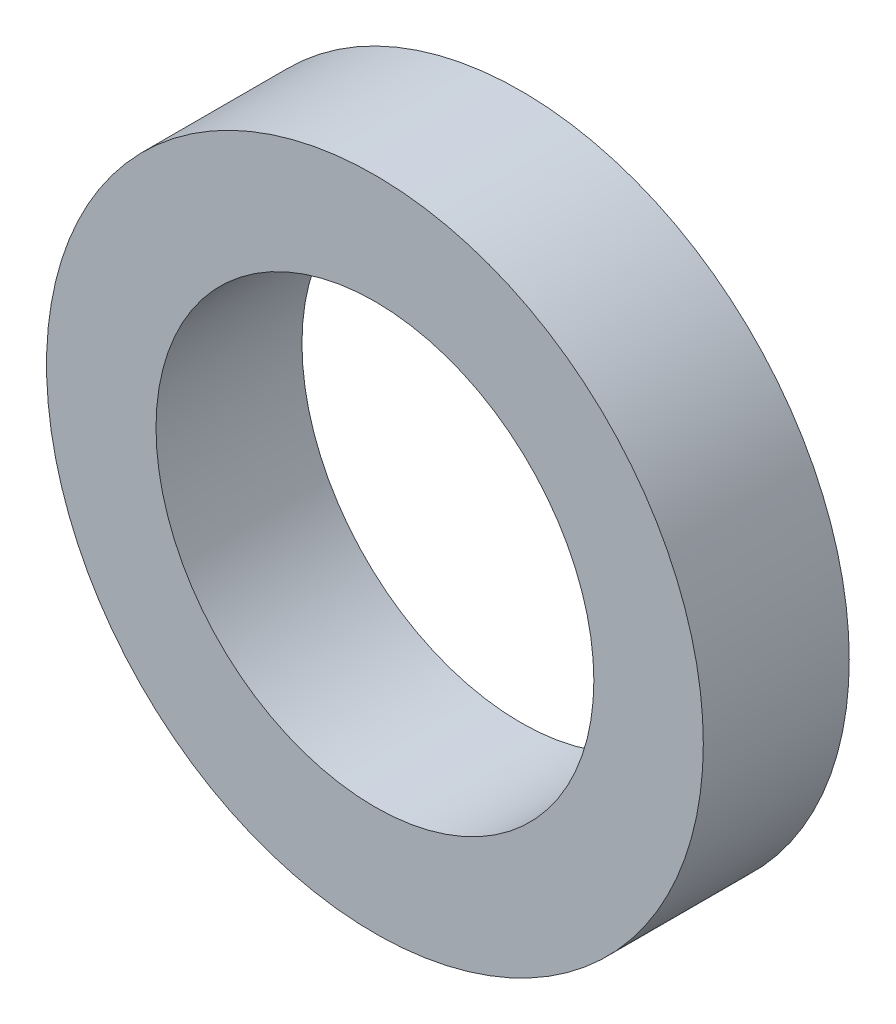
ISO-10303-21;
HEADER;
FILE_DESCRIPTION(('STEP AP214'),'2;1');
FILE_NAME('part.step','',(''),(''),'','','');
FILE_SCHEMA(('AUTOMOTIVE_DESIGN { 1 0 10303 214 1 1 1 1 }'));
ENDSEC;
DATA;
#1=APPLICATION_CONTEXT('core data for automotive mechanical design processes');
#2=APPLICATION_PROTOCOL_DEFINITION('international standard','automotive_design',2000,#1);
#3=PRODUCT_CONTEXT('',#1,'mechanical');
#4=PRODUCT('Part','Part','',(#3));
#5=PRODUCT_RELATED_PRODUCT_CATEGORY('part','',(#4));
#6=PRODUCT_DEFINITION_FORMATION('','',#4);
#7=PRODUCT_DEFINITION_CONTEXT('part definition',#1,'design');
#8=PRODUCT_DEFINITION('design','',#6,#7);
#9=PRODUCT_DEFINITION_SHAPE('','',#8);
#10=(LENGTH_UNIT() NAMED_UNIT(*) SI_UNIT(.MILLI.,.METRE.));
#11=(NAMED_UNIT(*) PLANE_ANGLE_UNIT() SI_UNIT($,.RADIAN.));
#12=(NAMED_UNIT(*) SI_UNIT($,.STERADIAN.) SOLID_ANGLE_UNIT());
#13=UNCERTAINTY_MEASURE_WITH_UNIT(LENGTH_MEASURE(1.E-05),#10,'distance_accuracy_value','');
#14=(GEOMETRIC_REPRESENTATION_CONTEXT(3) GLOBAL_UNCERTAINTY_ASSIGNED_CONTEXT((#13)) GLOBAL_UNIT_ASSIGNED_CONTEXT((#10,
#11,#12)) REPRESENTATION_CONTEXT('',''));
#15=CARTESIAN_POINT('',(0.,0.,0.));
#16=DIRECTION('',(0.,0.,1.));
#17=DIRECTION('',(1.,0.,0.));
#18=AXIS2_PLACEMENT_3D('',#15,#16,#17);
#19=CARTESIAN_POINT('',(0.,0.,2.));
#20=DIRECTION('',(0.,0.,1.));
#21=DIRECTION('',(1.,0.,0.));
#22=AXIS2_PLACEMENT_3D('',#19,#20,#21);
#23=PLANE('',#22);
#24=CARTESIAN_POINT('',(0.,0.,2.));
#25=DIRECTION('',(0.,0.,1.));
#26=DIRECTION('',(1.,0.,0.));
#27=AXIS2_PLACEMENT_3D('',#24,#25,#26);
#28=CIRCLE('',#27,4.5);
#29=CARTESIAN_POINT('',(4.5,0.,2.));
#30=VERTEX_POINT('',#29);
#31=EDGE_CURVE('E10',#30,#30,#28,.T.);
#32=ORIENTED_EDGE('',*,*,#31,.T.);
#33=EDGE_LOOP('',(#32));
#34=FACE_BOUND('',#33,.T.);
#35=CARTESIAN_POINT('',(0.,0.,2.));
#36=DIRECTION('',(0.,0.,1.));
#37=DIRECTION('',(1.,0.,0.));
#38=AXIS2_PLACEMENT_3D('',#35,#36,#37);
#39=CIRCLE('',#38,3.);
#40=CARTESIAN_POINT('',(3.,0.,2.));
#41=VERTEX_POINT('',#40);
#42=EDGE_CURVE('E56',#41,#41,#39,.T.);
#43=ORIENTED_EDGE('',*,*,#42,.F.);
#44=EDGE_LOOP('',(#43));
#45=FACE_BOUND('',#44,.T.);
#46=ADVANCED_FACE('F43',(#34,#45),#23,.T.);
#47=CARTESIAN_POINT('',(0.,0.,0.));
#48=DIRECTION('',(0.,0.,1.));
#49=DIRECTION('',(1.,0.,0.));
#50=AXIS2_PLACEMENT_3D('',#47,#48,#49);
#51=PLANE('',#50);
#52=CARTESIAN_POINT('',(0.,0.,0.));
#53=DIRECTION('',(0.,0.,1.));
#54=DIRECTION('',(1.,0.,0.));
#55=AXIS2_PLACEMENT_3D('',#52,#53,#54);
#56=CIRCLE('',#55,4.5);
#57=CARTESIAN_POINT('',(4.5,0.,0.));
#58=VERTEX_POINT('',#57);
#59=EDGE_CURVE('E47',#58,#58,#56,.T.);
#60=ORIENTED_EDGE('',*,*,#59,.F.);
#61=EDGE_LOOP('',(#60));
#62=FACE_BOUND('',#61,.T.);
#63=CARTESIAN_POINT('',(0.,0.,0.));
#64=DIRECTION('',(0.,0.,1.));
#65=DIRECTION('',(1.,0.,0.));
#66=AXIS2_PLACEMENT_3D('',#63,#64,#65);
#67=CIRCLE('',#66,3.);
#68=CARTESIAN_POINT('',(3.,0.,0.));
#69=VERTEX_POINT('',#68);
#70=EDGE_CURVE('E58',#69,#69,#67,.T.);
#71=ORIENTED_EDGE('',*,*,#70,.T.);
#72=EDGE_LOOP('',(#71));
#73=FACE_BOUND('',#72,.T.);
#74=ADVANCED_FACE('F70',(#62,#73),#51,.F.);
#75=CARTESIAN_POINT('',(0.,0.,2.));
#76=DIRECTION('',(0.,0.,-1.));
#77=DIRECTION('',(-1.,0.,0.));
#78=AXIS2_PLACEMENT_3D('',#75,#76,#77);
#79=CYLINDRICAL_SURFACE('',#78,4.5);
#80=ORIENTED_EDGE('',*,*,#31,.F.);
#81=EDGE_LOOP('',(#80));
#82=FACE_BOUND('',#81,.T.);
#83=ORIENTED_EDGE('',*,*,#59,.T.);
#84=EDGE_LOOP('',(#83));
#85=FACE_BOUND('',#84,.T.);
#86=ADVANCED_FACE('F45',(#82,#85),#79,.T.);
#87=CARTESIAN_POINT('',(0.,0.,2.));
#88=DIRECTION('',(0.,0.,-1.));
#89=DIRECTION('',(-1.,0.,0.));
#90=AXIS2_PLACEMENT_3D('',#87,#88,#89);
#91=CYLINDRICAL_SURFACE('',#90,3.);
#92=ORIENTED_EDGE('',*,*,#42,.T.);
#93=EDGE_LOOP('',(#92));
#94=FACE_BOUND('',#93,.T.);
#95=ORIENTED_EDGE('',*,*,#70,.F.);
#96=EDGE_LOOP('',(#95));
#97=FACE_BOUND('',#96,.T.);
#98=ADVANCED_FACE('F66',(#94,#97),#91,.F.);
#99=CLOSED_SHELL('',(#46,#74,#86,#98));
#100=MANIFOLD_SOLID_BREP('B2',#99);
#101=ADVANCED_BREP_SHAPE_REPRESENTATION('',(#18,#100),#14);
#102=SHAPE_DEFINITION_REPRESENTATION(#9,#101);
ENDSEC;
END-ISO-10303-21;
